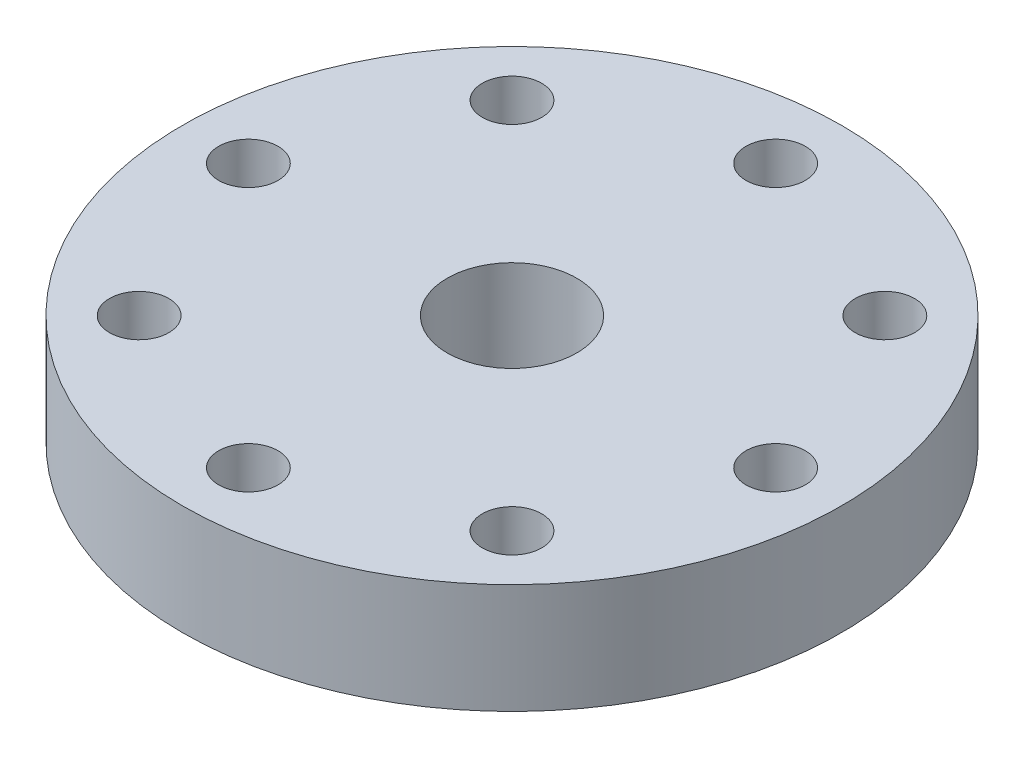
ISO-10303-21;
HEADER;
FILE_DESCRIPTION(('STEP AP214'),'2;1');
FILE_NAME('part.step','',(''),(''),'','','');
FILE_SCHEMA(('AUTOMOTIVE_DESIGN { 1 0 10303 214 1 1 1 1 }'));
ENDSEC;
DATA;
#1=APPLICATION_CONTEXT('core data for automotive mechanical design processes');
#2=APPLICATION_PROTOCOL_DEFINITION('international standard','automotive_design',2000,#1);
#3=PRODUCT_CONTEXT('',#1,'mechanical');
#4=PRODUCT('Part','Part','',(#3));
#5=PRODUCT_RELATED_PRODUCT_CATEGORY('part','',(#4));
#6=PRODUCT_DEFINITION_FORMATION('','',#4);
#7=PRODUCT_DEFINITION_CONTEXT('part definition',#1,'design');
#8=PRODUCT_DEFINITION('design','',#6,#7);
#9=PRODUCT_DEFINITION_SHAPE('','',#8);
#10=(LENGTH_UNIT() NAMED_UNIT(*) SI_UNIT(.MILLI.,.METRE.));
#11=(NAMED_UNIT(*) PLANE_ANGLE_UNIT() SI_UNIT($,.RADIAN.));
#12=(NAMED_UNIT(*) SI_UNIT($,.STERADIAN.) SOLID_ANGLE_UNIT());
#13=UNCERTAINTY_MEASURE_WITH_UNIT(LENGTH_MEASURE(1.E-05),#10,'distance_accuracy_value','');
#14=(GEOMETRIC_REPRESENTATION_CONTEXT(3) GLOBAL_UNCERTAINTY_ASSIGNED_CONTEXT((#13)) GLOBAL_UNIT_ASSIGNED_CONTEXT((#10,
#11,#12)) REPRESENTATION_CONTEXT('',''));
#15=CARTESIAN_POINT('',(0.,0.,0.));
#16=DIRECTION('',(0.,0.,1.));
#17=DIRECTION('',(1.,0.,0.));
#18=AXIS2_PLACEMENT_3D('',#15,#16,#17);
#19=CARTESIAN_POINT('',(0.,5.,0.));
#20=DIRECTION('',(0.,-1.,0.));
#21=DIRECTION('',(0.,0.,-1.));
#22=AXIS2_PLACEMENT_3D('',#19,#20,#21);
#23=CYLINDRICAL_SURFACE('',#22,15.);
#24=CARTESIAN_POINT('',(0.,5.,0.));
#25=DIRECTION('',(0.,1.,0.));
#26=DIRECTION('',(0.,0.,1.));
#27=AXIS2_PLACEMENT_3D('',#24,#25,#26);
#28=CIRCLE('',#27,15.);
#29=CARTESIAN_POINT('',(0.,5.,15.));
#30=VERTEX_POINT('',#29);
#31=EDGE_CURVE('E10',#30,#30,#28,.T.);
#32=ORIENTED_EDGE('',*,*,#31,.F.);
#33=EDGE_LOOP('',(#32));
#34=FACE_BOUND('',#33,.T.);
#35=CARTESIAN_POINT('',(0.,0.,0.));
#36=DIRECTION('',(0.,1.,0.));
#37=DIRECTION('',(0.,0.,1.));
#38=AXIS2_PLACEMENT_3D('',#35,#36,#37);
#39=CIRCLE('',#38,15.);
#40=CARTESIAN_POINT('',(0.,0.,15.));
#41=VERTEX_POINT('',#40);
#42=EDGE_CURVE('E33',#41,#41,#39,.T.);
#43=ORIENTED_EDGE('',*,*,#42,.T.);
#44=EDGE_LOOP('',(#43));
#45=FACE_BOUND('',#44,.T.);
#46=ADVANCED_FACE('F30',(#34,#45),#23,.T.);
#47=CARTESIAN_POINT('',(0.,5.,0.));
#48=DIRECTION('',(0.,1.,0.));
#49=DIRECTION('',(0.,0.,1.));
#50=AXIS2_PLACEMENT_3D('',#47,#48,#49);
#51=PLANE('',#50);
#52=CARTESIAN_POINT('',(-12.,5.,0.));
#53=DIRECTION('',(0.,1.,0.));
#54=DIRECTION('',(0.,0.,1.));
#55=AXIS2_PLACEMENT_3D('',#52,#53,#54);
#56=CIRCLE('',#55,1.35);
#57=CARTESIAN_POINT('',(-12.,5.,1.35));
#58=VERTEX_POINT('',#57);
#59=EDGE_CURVE('E92',#58,#58,#56,.T.);
#60=ORIENTED_EDGE('',*,*,#59,.F.);
#61=EDGE_LOOP('',(#60));
#62=FACE_BOUND('',#61,.T.);
#63=CARTESIAN_POINT('',(-8.48528137423856,5.,-8.48528137423859));
#64=DIRECTION('',(0.,1.,0.));
#65=DIRECTION('',(0.,0.,1.));
#66=AXIS2_PLACEMENT_3D('',#63,#64,#65);
#67=CIRCLE('',#66,1.35);
#68=CARTESIAN_POINT('',(-8.48528137423856,5.,-7.13528137423859));
#69=VERTEX_POINT('',#68);
#70=EDGE_CURVE('E86',#69,#69,#67,.T.);
#71=ORIENTED_EDGE('',*,*,#70,.F.);
#72=EDGE_LOOP('',(#71));
#73=FACE_BOUND('',#72,.T.);
#74=CARTESIAN_POINT('',(0.,5.,-12.));
#75=DIRECTION('',(0.,1.,0.));
#76=DIRECTION('',(0.,0.,1.));
#77=AXIS2_PLACEMENT_3D('',#74,#75,#76);
#78=CIRCLE('',#77,1.35);
#79=CARTESIAN_POINT('',(0.,5.,-10.65));
#80=VERTEX_POINT('',#79);
#81=EDGE_CURVE('E80',#80,#80,#78,.T.);
#82=ORIENTED_EDGE('',*,*,#81,.F.);
#83=EDGE_LOOP('',(#82));
#84=FACE_BOUND('',#83,.T.);
#85=CARTESIAN_POINT('',(8.48528137423862,5.,-8.48528137423852));
#86=DIRECTION('',(0.,1.,0.));
#87=DIRECTION('',(0.,0.,1.));
#88=AXIS2_PLACEMENT_3D('',#85,#86,#87);
#89=CIRCLE('',#88,1.35);
#90=CARTESIAN_POINT('',(8.48528137423862,5.,-7.13528137423852));
#91=VERTEX_POINT('',#90);
#92=EDGE_CURVE('E74',#91,#91,#89,.T.);
#93=ORIENTED_EDGE('',*,*,#92,.F.);
#94=EDGE_LOOP('',(#93));
#95=FACE_BOUND('',#94,.T.);
#96=CARTESIAN_POINT('',(12.,5.,0.));
#97=DIRECTION('',(0.,1.,0.));
#98=DIRECTION('',(0.,0.,1.));
#99=AXIS2_PLACEMENT_3D('',#96,#97,#98);
#100=CIRCLE('',#99,1.35);
#101=CARTESIAN_POINT('',(12.,5.,1.35000000000008));
#102=VERTEX_POINT('',#101);
#103=EDGE_CURVE('E68',#102,#102,#100,.T.);
#104=ORIENTED_EDGE('',*,*,#103,.F.);
#105=EDGE_LOOP('',(#104));
#106=FACE_BOUND('',#105,.T.);
#107=CARTESIAN_POINT('',(8.4852813742385,5.,8.48528137423865));
#108=DIRECTION('',(0.,1.,0.));
#109=DIRECTION('',(0.,0.,1.));
#110=AXIS2_PLACEMENT_3D('',#107,#108,#109);
#111=CIRCLE('',#110,1.35);
#112=CARTESIAN_POINT('',(8.4852813742385,5.,9.83528137423865));
#113=VERTEX_POINT('',#112);
#114=EDGE_CURVE('E62',#113,#113,#111,.T.);
#115=ORIENTED_EDGE('',*,*,#114,.F.);
#116=EDGE_LOOP('',(#115));
#117=FACE_BOUND('',#116,.T.);
#118=CARTESIAN_POINT('',(-1.25693328198353E-13,5.,12.));
#119=DIRECTION('',(0.,1.,0.));
#120=DIRECTION('',(0.,0.,1.));
#121=AXIS2_PLACEMENT_3D('',#118,#119,#120);
#122=CIRCLE('',#121,1.35);
#123=CARTESIAN_POINT('',(-1.25693328198353E-13,5.,13.35));
#124=VERTEX_POINT('',#123);
#125=EDGE_CURVE('E56',#124,#124,#122,.T.);
#126=ORIENTED_EDGE('',*,*,#125,.F.);
#127=EDGE_LOOP('',(#126));
#128=FACE_BOUND('',#127,.T.);
#129=CARTESIAN_POINT('',(-8.48528137423868,5.,8.48528137423847));
#130=DIRECTION('',(0.,1.,0.));
#131=DIRECTION('',(0.,0.,1.));
#132=AXIS2_PLACEMENT_3D('',#129,#130,#131);
#133=CIRCLE('',#132,1.35);
#134=CARTESIAN_POINT('',(-8.48528137423868,5.,9.83528137423847));
#135=VERTEX_POINT('',#134);
#136=EDGE_CURVE('E50',#135,#135,#133,.T.);
#137=ORIENTED_EDGE('',*,*,#136,.F.);
#138=EDGE_LOOP('',(#137));
#139=FACE_BOUND('',#138,.T.);
#140=CARTESIAN_POINT('',(0.,5.,0.));
#141=DIRECTION('',(0.,1.,0.));
#142=DIRECTION('',(0.,0.,1.));
#143=AXIS2_PLACEMENT_3D('',#140,#141,#142);
#144=CIRCLE('',#143,2.95);
#145=CARTESIAN_POINT('',(0.,5.,2.95));
#146=VERTEX_POINT('',#145);
#147=EDGE_CURVE('E42',#146,#146,#144,.T.);
#148=ORIENTED_EDGE('',*,*,#147,.F.);
#149=EDGE_LOOP('',(#148));
#150=FACE_BOUND('',#149,.T.);
#151=ORIENTED_EDGE('',*,*,#31,.T.);
#152=EDGE_LOOP('',(#151));
#153=FACE_BOUND('',#152,.T.);
#154=ADVANCED_FACE('F98',(#62,#73,#84,#95,#106,#117,#128,#139,#150,#153),#51,.T.);
#155=CARTESIAN_POINT('',(0.,0.,0.));
#156=DIRECTION('',(0.,1.,0.));
#157=DIRECTION('',(0.,0.,1.));
#158=AXIS2_PLACEMENT_3D('',#155,#156,#157);
#159=PLANE('',#158);
#160=CARTESIAN_POINT('',(-12.,0.,0.));
#161=DIRECTION('',(0.,1.,0.));
#162=DIRECTION('',(0.,0.,1.));
#163=AXIS2_PLACEMENT_3D('',#160,#161,#162);
#164=CIRCLE('',#163,1.35);
#165=CARTESIAN_POINT('',(-12.,0.,1.35));
#166=VERTEX_POINT('',#165);
#167=EDGE_CURVE('E89',#166,#166,#164,.T.);
#168=ORIENTED_EDGE('',*,*,#167,.T.);
#169=EDGE_LOOP('',(#168));
#170=FACE_BOUND('',#169,.T.);
#171=CARTESIAN_POINT('',(-8.48528137423856,0.,-8.48528137423859));
#172=DIRECTION('',(0.,1.,0.));
#173=DIRECTION('',(0.,0.,1.));
#174=AXIS2_PLACEMENT_3D('',#171,#172,#173);
#175=CIRCLE('',#174,1.35);
#176=CARTESIAN_POINT('',(-8.48528137423856,0.,-7.13528137423859));
#177=VERTEX_POINT('',#176);
#178=EDGE_CURVE('E83',#177,#177,#175,.T.);
#179=ORIENTED_EDGE('',*,*,#178,.T.);
#180=EDGE_LOOP('',(#179));
#181=FACE_BOUND('',#180,.T.);
#182=CARTESIAN_POINT('',(0.,0.,-12.));
#183=DIRECTION('',(0.,1.,0.));
#184=DIRECTION('',(0.,0.,1.));
#185=AXIS2_PLACEMENT_3D('',#182,#183,#184);
#186=CIRCLE('',#185,1.35);
#187=CARTESIAN_POINT('',(0.,0.,-10.65));
#188=VERTEX_POINT('',#187);
#189=EDGE_CURVE('E77',#188,#188,#186,.T.);
#190=ORIENTED_EDGE('',*,*,#189,.T.);
#191=EDGE_LOOP('',(#190));
#192=FACE_BOUND('',#191,.T.);
#193=CARTESIAN_POINT('',(8.48528137423862,0.,-8.48528137423852));
#194=DIRECTION('',(0.,1.,0.));
#195=DIRECTION('',(0.,0.,1.));
#196=AXIS2_PLACEMENT_3D('',#193,#194,#195);
#197=CIRCLE('',#196,1.35);
#198=CARTESIAN_POINT('',(8.48528137423862,0.,-7.13528137423852));
#199=VERTEX_POINT('',#198);
#200=EDGE_CURVE('E71',#199,#199,#197,.T.);
#201=ORIENTED_EDGE('',*,*,#200,.T.);
#202=EDGE_LOOP('',(#201));
#203=FACE_BOUND('',#202,.T.);
#204=CARTESIAN_POINT('',(12.,0.,0.));
#205=DIRECTION('',(0.,1.,0.));
#206=DIRECTION('',(0.,0.,1.));
#207=AXIS2_PLACEMENT_3D('',#204,#205,#206);
#208=CIRCLE('',#207,1.35);
#209=CARTESIAN_POINT('',(12.,0.,1.35000000000008));
#210=VERTEX_POINT('',#209);
#211=EDGE_CURVE('E65',#210,#210,#208,.T.);
#212=ORIENTED_EDGE('',*,*,#211,.T.);
#213=EDGE_LOOP('',(#212));
#214=FACE_BOUND('',#213,.T.);
#215=CARTESIAN_POINT('',(8.4852813742385,0.,8.48528137423865));
#216=DIRECTION('',(0.,1.,0.));
#217=DIRECTION('',(0.,0.,1.));
#218=AXIS2_PLACEMENT_3D('',#215,#216,#217);
#219=CIRCLE('',#218,1.35);
#220=CARTESIAN_POINT('',(8.4852813742385,0.,9.83528137423865));
#221=VERTEX_POINT('',#220);
#222=EDGE_CURVE('E59',#221,#221,#219,.T.);
#223=ORIENTED_EDGE('',*,*,#222,.T.);
#224=EDGE_LOOP('',(#223));
#225=FACE_BOUND('',#224,.T.);
#226=CARTESIAN_POINT('',(-1.25693328198353E-13,0.,12.));
#227=DIRECTION('',(0.,1.,0.));
#228=DIRECTION('',(0.,0.,1.));
#229=AXIS2_PLACEMENT_3D('',#226,#227,#228);
#230=CIRCLE('',#229,1.35);
#231=CARTESIAN_POINT('',(-1.25693328198353E-13,0.,13.35));
#232=VERTEX_POINT('',#231);
#233=EDGE_CURVE('E53',#232,#232,#230,.T.);
#234=ORIENTED_EDGE('',*,*,#233,.T.);
#235=EDGE_LOOP('',(#234));
#236=FACE_BOUND('',#235,.T.);
#237=CARTESIAN_POINT('',(-8.48528137423868,0.,8.48528137423847));
#238=DIRECTION('',(0.,1.,0.));
#239=DIRECTION('',(0.,0.,1.));
#240=AXIS2_PLACEMENT_3D('',#237,#238,#239);
#241=CIRCLE('',#240,1.35);
#242=CARTESIAN_POINT('',(-8.48528137423868,0.,9.83528137423847));
#243=VERTEX_POINT('',#242);
#244=EDGE_CURVE('E45',#243,#243,#241,.T.);
#245=ORIENTED_EDGE('',*,*,#244,.T.);
#246=EDGE_LOOP('',(#245));
#247=FACE_BOUND('',#246,.T.);
#248=CARTESIAN_POINT('',(0.,0.,0.));
#249=DIRECTION('',(0.,1.,0.));
#250=DIRECTION('',(0.,0.,1.));
#251=AXIS2_PLACEMENT_3D('',#248,#249,#250);
#252=CIRCLE('',#251,2.95);
#253=CARTESIAN_POINT('',(0.,0.,2.95));
#254=VERTEX_POINT('',#253);
#255=EDGE_CURVE('E40',#254,#254,#252,.T.);
#256=ORIENTED_EDGE('',*,*,#255,.T.);
#257=EDGE_LOOP('',(#256));
#258=FACE_BOUND('',#257,.T.);
#259=ORIENTED_EDGE('',*,*,#42,.F.);
#260=EDGE_LOOP('',(#259));
#261=FACE_BOUND('',#260,.T.);
#262=ADVANCED_FACE('F101',(#170,#181,#192,#203,#214,#225,#236,#247,#258,#261),#159,.F.);
#263=CARTESIAN_POINT('',(0.,0.,0.));
#264=DIRECTION('',(0.,1.,0.));
#265=DIRECTION('',(0.,0.,1.));
#266=AXIS2_PLACEMENT_3D('',#263,#264,#265);
#267=CYLINDRICAL_SURFACE('',#266,2.95);
#268=ORIENTED_EDGE('',*,*,#255,.F.);
#269=EDGE_LOOP('',(#268));
#270=FACE_BOUND('',#269,.T.);
#271=ORIENTED_EDGE('',*,*,#147,.T.);
#272=EDGE_LOOP('',(#271));
#273=FACE_BOUND('',#272,.T.);
#274=ADVANCED_FACE('F119',(#270,#273),#267,.F.);
#275=CARTESIAN_POINT('',(-8.48528137423868,5.,8.48528137423847));
#276=DIRECTION('',(0.,1.,0.));
#277=DIRECTION('',(0.,0.,1.));
#278=AXIS2_PLACEMENT_3D('',#275,#276,#277);
#279=CYLINDRICAL_SURFACE('',#278,1.35);
#280=ORIENTED_EDGE('',*,*,#244,.F.);
#281=EDGE_LOOP('',(#280));
#282=FACE_BOUND('',#281,.T.);
#283=ORIENTED_EDGE('',*,*,#136,.T.);
#284=EDGE_LOOP('',(#283));
#285=FACE_BOUND('',#284,.T.);
#286=ADVANCED_FACE('F121',(#282,#285),#279,.F.);
#287=CARTESIAN_POINT('',(-1.25693328198353E-13,5.,12.));
#288=DIRECTION('',(0.,1.,0.));
#289=DIRECTION('',(0.,0.,1.));
#290=AXIS2_PLACEMENT_3D('',#287,#288,#289);
#291=CYLINDRICAL_SURFACE('',#290,1.35);
#292=ORIENTED_EDGE('',*,*,#233,.F.);
#293=EDGE_LOOP('',(#292));
#294=FACE_BOUND('',#293,.T.);
#295=ORIENTED_EDGE('',*,*,#125,.T.);
#296=EDGE_LOOP('',(#295));
#297=FACE_BOUND('',#296,.T.);
#298=ADVANCED_FACE('F128',(#294,#297),#291,.F.);
#299=CARTESIAN_POINT('',(8.4852813742385,5.,8.48528137423865));
#300=DIRECTION('',(0.,1.,0.));
#301=DIRECTION('',(0.,0.,1.));
#302=AXIS2_PLACEMENT_3D('',#299,#300,#301);
#303=CYLINDRICAL_SURFACE('',#302,1.35);
#304=ORIENTED_EDGE('',*,*,#222,.F.);
#305=EDGE_LOOP('',(#304));
#306=FACE_BOUND('',#305,.T.);
#307=ORIENTED_EDGE('',*,*,#114,.T.);
#308=EDGE_LOOP('',(#307));
#309=FACE_BOUND('',#308,.T.);
#310=ADVANCED_FACE('F164',(#306,#309),#303,.F.);
#311=CARTESIAN_POINT('',(12.,5.,0.));
#312=DIRECTION('',(0.,1.,0.));
#313=DIRECTION('',(0.,0.,1.));
#314=AXIS2_PLACEMENT_3D('',#311,#312,#313);
#315=CYLINDRICAL_SURFACE('',#314,1.35);
#316=ORIENTED_EDGE('',*,*,#211,.F.);
#317=EDGE_LOOP('',(#316));
#318=FACE_BOUND('',#317,.T.);
#319=ORIENTED_EDGE('',*,*,#103,.T.);
#320=EDGE_LOOP('',(#319));
#321=FACE_BOUND('',#320,.T.);
#322=ADVANCED_FACE('F174',(#318,#321),#315,.F.);
#323=CARTESIAN_POINT('',(8.48528137423862,5.,-8.48528137423852));
#324=DIRECTION('',(0.,1.,0.));
#325=DIRECTION('',(0.,0.,1.));
#326=AXIS2_PLACEMENT_3D('',#323,#324,#325);
#327=CYLINDRICAL_SURFACE('',#326,1.35);
#328=ORIENTED_EDGE('',*,*,#200,.F.);
#329=EDGE_LOOP('',(#328));
#330=FACE_BOUND('',#329,.T.);
#331=ORIENTED_EDGE('',*,*,#92,.T.);
#332=EDGE_LOOP('',(#331));
#333=FACE_BOUND('',#332,.T.);
#334=ADVANCED_FACE('F184',(#330,#333),#327,.F.);
#335=CARTESIAN_POINT('',(0.,5.,-12.));
#336=DIRECTION('',(0.,1.,0.));
#337=DIRECTION('',(0.,0.,1.));
#338=AXIS2_PLACEMENT_3D('',#335,#336,#337);
#339=CYLINDRICAL_SURFACE('',#338,1.35);
#340=ORIENTED_EDGE('',*,*,#189,.F.);
#341=EDGE_LOOP('',(#340));
#342=FACE_BOUND('',#341,.T.);
#343=ORIENTED_EDGE('',*,*,#81,.T.);
#344=EDGE_LOOP('',(#343));
#345=FACE_BOUND('',#344,.T.);
#346=ADVANCED_FACE('F194',(#342,#345),#339,.F.);
#347=CARTESIAN_POINT('',(-8.48528137423856,5.,-8.48528137423859));
#348=DIRECTION('',(0.,1.,0.));
#349=DIRECTION('',(0.,0.,1.));
#350=AXIS2_PLACEMENT_3D('',#347,#348,#349);
#351=CYLINDRICAL_SURFACE('',#350,1.35);
#352=ORIENTED_EDGE('',*,*,#178,.F.);
#353=EDGE_LOOP('',(#352));
#354=FACE_BOUND('',#353,.T.);
#355=ORIENTED_EDGE('',*,*,#70,.T.);
#356=EDGE_LOOP('',(#355));
#357=FACE_BOUND('',#356,.T.);
#358=ADVANCED_FACE('F204',(#354,#357),#351,.F.);
#359=CARTESIAN_POINT('',(-12.,5.,0.));
#360=DIRECTION('',(0.,1.,0.));
#361=DIRECTION('',(0.,0.,1.));
#362=AXIS2_PLACEMENT_3D('',#359,#360,#361);
#363=CYLINDRICAL_SURFACE('',#362,1.35);
#364=ORIENTED_EDGE('',*,*,#167,.F.);
#365=EDGE_LOOP('',(#364));
#366=FACE_BOUND('',#365,.T.);
#367=ORIENTED_EDGE('',*,*,#59,.T.);
#368=EDGE_LOOP('',(#367));
#369=FACE_BOUND('',#368,.T.);
#370=ADVANCED_FACE('F96',(#366,#369),#363,.F.);
#371=CLOSED_SHELL('',(#46,#154,#262,#274,#286,#298,#310,#322,#334,#346,#358,#370));
#372=MANIFOLD_SOLID_BREP('B2',#371);
#373=ADVANCED_BREP_SHAPE_REPRESENTATION('',(#18,#372),#14);
#374=SHAPE_DEFINITION_REPRESENTATION(#9,#373);
ENDSEC;
END-ISO-10303-21;
